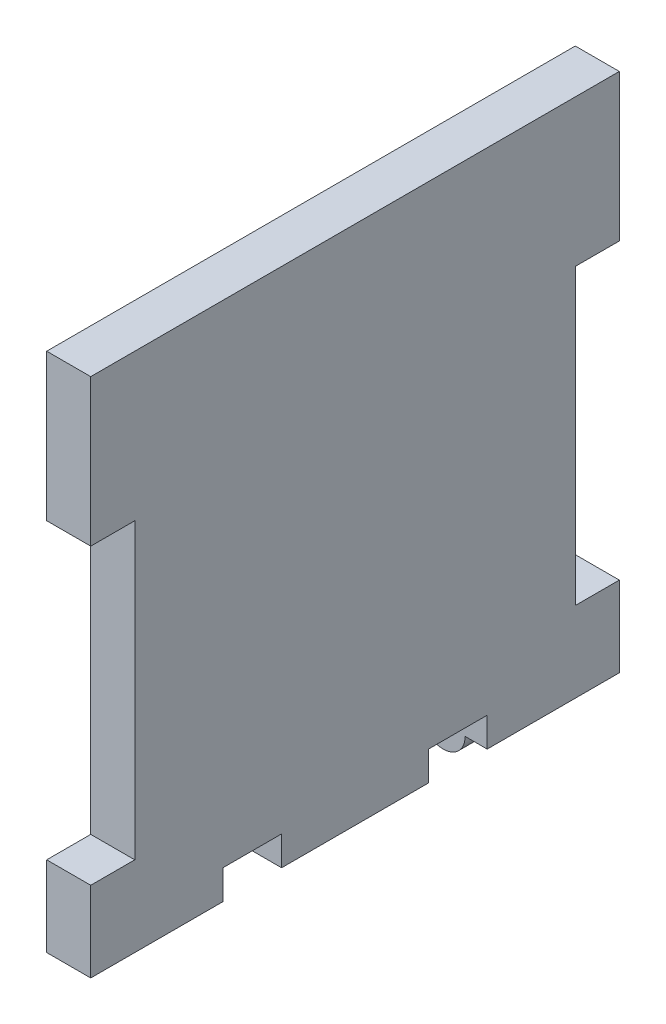
ISO-10303-21;
HEADER;
FILE_DESCRIPTION(('STEP AP214'),'2;1');
FILE_NAME('part.step','',(''),(''),'','','');
FILE_SCHEMA(('AUTOMOTIVE_DESIGN { 1 0 10303 214 1 1 1 1 }'));
ENDSEC;
DATA;
#1=APPLICATION_CONTEXT('core data for automotive mechanical design processes');
#2=APPLICATION_PROTOCOL_DEFINITION('international standard','automotive_design',2000,#1);
#3=PRODUCT_CONTEXT('',#1,'mechanical');
#4=PRODUCT('Part','Part','',(#3));
#5=PRODUCT_RELATED_PRODUCT_CATEGORY('part','',(#4));
#6=PRODUCT_DEFINITION_FORMATION('','',#4);
#7=PRODUCT_DEFINITION_CONTEXT('part definition',#1,'design');
#8=PRODUCT_DEFINITION('design','',#6,#7);
#9=PRODUCT_DEFINITION_SHAPE('','',#8);
#10=(LENGTH_UNIT() NAMED_UNIT(*) SI_UNIT(.MILLI.,.METRE.));
#11=(NAMED_UNIT(*) PLANE_ANGLE_UNIT() SI_UNIT($,.RADIAN.));
#12=(NAMED_UNIT(*) SI_UNIT($,.STERADIAN.) SOLID_ANGLE_UNIT());
#13=UNCERTAINTY_MEASURE_WITH_UNIT(LENGTH_MEASURE(1.E-05),#10,'distance_accuracy_value','');
#14=(GEOMETRIC_REPRESENTATION_CONTEXT(3) GLOBAL_UNCERTAINTY_ASSIGNED_CONTEXT((#13)) GLOBAL_UNIT_ASSIGNED_CONTEXT((#10,
#11,#12)) REPRESENTATION_CONTEXT('',''));
#15=CARTESIAN_POINT('',(0.,0.,0.));
#16=DIRECTION('',(0.,0.,1.));
#17=DIRECTION('',(1.,0.,0.));
#18=AXIS2_PLACEMENT_3D('',#15,#16,#17);
#19=CARTESIAN_POINT('',(3.,0.,15.));
#20=DIRECTION('',(0.,1.,0.));
#21=DIRECTION('',(0.,0.,1.));
#22=AXIS2_PLACEMENT_3D('',#19,#20,#21);
#23=PLANE('',#22);
#24=DIRECTION('',(0.,0.,-1.));
#25=VECTOR('',#24,1.);
#26=CARTESIAN_POINT('',(3.,0.,-15.));
#27=LINE('',#26,#25);
#28=CARTESIAN_POINT('',(3.,0.,5.));
#29=VERTEX_POINT('',#28);
#30=CARTESIAN_POINT('',(3.,0.,-5.));
#31=VERTEX_POINT('',#30);
#32=EDGE_CURVE('E323',#29,#31,#27,.T.);
#33=ORIENTED_EDGE('',*,*,#32,.F.);
#34=DIRECTION('',(-1.,0.,0.));
#35=VECTOR('',#34,1.);
#36=CARTESIAN_POINT('',(10.,0.,5.));
#37=LINE('',#36,#35);
#38=CARTESIAN_POINT('',(0.,0.,5.));
#39=VERTEX_POINT('',#38);
#40=EDGE_CURVE('E272',#29,#39,#37,.T.);
#41=ORIENTED_EDGE('',*,*,#40,.T.);
#42=DIRECTION('',(0.,0.,-1.));
#43=VECTOR('',#42,1.);
#44=CARTESIAN_POINT('',(0.,0.,15.));
#45=LINE('',#44,#43);
#46=CARTESIAN_POINT('',(0.,0.,-5.));
#47=VERTEX_POINT('',#46);
#48=EDGE_CURVE('E197',#39,#47,#45,.T.);
#49=ORIENTED_EDGE('',*,*,#48,.T.);
#50=DIRECTION('',(-1.,0.,0.));
#51=VECTOR('',#50,1.);
#52=CARTESIAN_POINT('',(10.,0.,-5.));
#53=LINE('',#52,#51);
#54=EDGE_CURVE('E294',#31,#47,#53,.T.);
#55=ORIENTED_EDGE('',*,*,#54,.F.);
#56=EDGE_LOOP('',(#33,#41,#49,#55));
#57=FACE_BOUND('',#56,.T.);
#58=ADVANCED_FACE('F33',(#57),#23,.F.);
#59=CARTESIAN_POINT('',(3.,0.,-9.));
#60=VERTEX_POINT('',#59);
#61=CARTESIAN_POINT('',(3.,0.,-18.));
#62=VERTEX_POINT('',#61);
#63=EDGE_CURVE('E112',#60,#62,#27,.T.);
#64=ORIENTED_EDGE('',*,*,#63,.F.);
#65=DIRECTION('',(-1.,0.,0.));
#66=VECTOR('',#65,1.);
#67=CARTESIAN_POINT('',(10.,0.,-9.));
#68=LINE('',#67,#66);
#69=CARTESIAN_POINT('',(1.49999999999999,0.,-9.));
#70=VERTEX_POINT('',#69);
#71=EDGE_CURVE('E286',#60,#70,#68,.T.);
#72=ORIENTED_EDGE('',*,*,#71,.T.);
#73=DIRECTION('',(0.,0.,1.));
#74=VECTOR('',#73,1.);
#75=CARTESIAN_POINT('',(1.49999999999999,0.,-12.));
#76=LINE('',#75,#74);
#77=CARTESIAN_POINT('',(1.49999999999999,0.,-12.));
#78=VERTEX_POINT('',#77);
#79=EDGE_CURVE('E310',#70,#78,#76,.F.);
#80=ORIENTED_EDGE('',*,*,#79,.T.);
#81=DIRECTION('',(1.,0.,0.));
#82=VECTOR('',#81,1.);
#83=CARTESIAN_POINT('',(3.,0.,-12.));
#84=LINE('',#83,#82);
#85=CARTESIAN_POINT('',(0.,0.,-12.));
#86=VERTEX_POINT('',#85);
#87=EDGE_CURVE('E305',#86,#78,#84,.T.);
#88=ORIENTED_EDGE('',*,*,#87,.F.);
#89=CARTESIAN_POINT('',(0.,0.,-18.));
#90=VERTEX_POINT('',#89);
#91=EDGE_CURVE('E195',#86,#90,#45,.T.);
#92=ORIENTED_EDGE('',*,*,#91,.T.);
#93=DIRECTION('',(-1.,0.,0.));
#94=VECTOR('',#93,1.);
#95=CARTESIAN_POINT('',(3.,0.,-18.));
#96=LINE('',#95,#94);
#97=EDGE_CURVE('E222',#62,#90,#96,.T.);
#98=ORIENTED_EDGE('',*,*,#97,.F.);
#99=EDGE_LOOP('',(#64,#72,#80,#88,#92,#98));
#100=FACE_BOUND('',#99,.T.);
#101=ADVANCED_FACE('F424',(#100),#23,.F.);
#102=DIRECTION('',(0.,0.,1.));
#103=VECTOR('',#102,1.);
#104=CARTESIAN_POINT('',(1.49999999999999,0.,9.));
#105=LINE('',#104,#103);
#106=CARTESIAN_POINT('',(1.49999999999999,0.,12.));
#107=VERTEX_POINT('',#106);
#108=CARTESIAN_POINT('',(1.49999999999999,0.,9.));
#109=VERTEX_POINT('',#108);
#110=EDGE_CURVE('E175',#107,#109,#105,.F.);
#111=ORIENTED_EDGE('',*,*,#110,.T.);
#112=DIRECTION('',(-1.,0.,0.));
#113=VECTOR('',#112,1.);
#114=CARTESIAN_POINT('',(10.,0.,9.));
#115=LINE('',#114,#113);
#116=CARTESIAN_POINT('',(3.,0.,9.));
#117=VERTEX_POINT('',#116);
#118=EDGE_CURVE('E269',#117,#109,#115,.T.);
#119=ORIENTED_EDGE('',*,*,#118,.F.);
#120=CARTESIAN_POINT('',(3.,0.,18.));
#121=VERTEX_POINT('',#120);
#122=EDGE_CURVE('E57',#121,#117,#27,.T.);
#123=ORIENTED_EDGE('',*,*,#122,.F.);
#124=DIRECTION('',(-1.,0.,0.));
#125=VECTOR('',#124,1.);
#126=CARTESIAN_POINT('',(3.,0.,18.));
#127=LINE('',#126,#125);
#128=CARTESIAN_POINT('',(0.,0.,18.));
#129=VERTEX_POINT('',#128);
#130=EDGE_CURVE('E168',#121,#129,#127,.T.);
#131=ORIENTED_EDGE('',*,*,#130,.T.);
#132=CARTESIAN_POINT('',(0.,0.,12.));
#133=VERTEX_POINT('',#132);
#134=EDGE_CURVE('E103',#129,#133,#45,.T.);
#135=ORIENTED_EDGE('',*,*,#134,.T.);
#136=DIRECTION('',(1.,0.,0.));
#137=VECTOR('',#136,1.);
#138=CARTESIAN_POINT('',(3.,0.,12.));
#139=LINE('',#138,#137);
#140=EDGE_CURVE('E48',#133,#107,#139,.T.);
#141=ORIENTED_EDGE('',*,*,#140,.T.);
#142=EDGE_LOOP('',(#111,#119,#123,#131,#135,#141));
#143=FACE_BOUND('',#142,.T.);
#144=ADVANCED_FACE('F351',(#143),#23,.F.);
#145=CARTESIAN_POINT('',(0.,0.,0.));
#146=DIRECTION('',(1.,0.,0.));
#147=DIRECTION('',(0.,0.,-1.));
#148=AXIS2_PLACEMENT_3D('',#145,#146,#147);
#149=PLANE('',#148);
#150=ORIENTED_EDGE('',*,*,#48,.F.);
#151=DIRECTION('',(0.,-1.,0.));
#152=VECTOR('',#151,1.);
#153=CARTESIAN_POINT('',(0.,0.,5.));
#154=LINE('',#153,#152);
#155=CARTESIAN_POINT('',(0.,2.,5.));
#156=VERTEX_POINT('',#155);
#157=EDGE_CURVE('E401',#156,#39,#154,.T.);
#158=ORIENTED_EDGE('',*,*,#157,.F.);
#159=DIRECTION('',(0.,0.,-1.));
#160=VECTOR('',#159,1.);
#161=CARTESIAN_POINT('',(0.,2.,9.));
#162=LINE('',#161,#160);
#163=CARTESIAN_POINT('',(0.,2.,9.));
#164=VERTEX_POINT('',#163);
#165=EDGE_CURVE('E403',#164,#156,#162,.T.);
#166=ORIENTED_EDGE('',*,*,#165,.F.);
#167=DIRECTION('',(0.,1.,0.));
#168=VECTOR('',#167,1.);
#169=CARTESIAN_POINT('',(0.,0.,9.));
#170=LINE('',#169,#168);
#171=CARTESIAN_POINT('',(0.,1.49999999999999,9.));
#172=VERTEX_POINT('',#171);
#173=EDGE_CURVE('E267',#172,#164,#170,.T.);
#174=ORIENTED_EDGE('',*,*,#173,.F.);
#175=DIRECTION('',(0.,0.,1.));
#176=VECTOR('',#175,1.);
#177=CARTESIAN_POINT('',(0.,1.49999999999999,9.));
#178=LINE('',#177,#176);
#179=CARTESIAN_POINT('',(0.,1.49999999999999,12.));
#180=VERTEX_POINT('',#179);
#181=EDGE_CURVE('E227',#172,#180,#178,.T.);
#182=ORIENTED_EDGE('',*,*,#181,.T.);
#183=DIRECTION('',(0.,-1.,0.));
#184=VECTOR('',#183,1.);
#185=CARTESIAN_POINT('',(0.,0.,12.));
#186=LINE('',#185,#184);
#187=EDGE_CURVE('E225',#180,#133,#186,.T.);
#188=ORIENTED_EDGE('',*,*,#187,.T.);
#189=ORIENTED_EDGE('',*,*,#134,.F.);
#190=DIRECTION('',(0.,-1.,0.));
#191=VECTOR('',#190,1.);
#192=CARTESIAN_POINT('',(0.,0.,18.));
#193=LINE('',#192,#191);
#194=CARTESIAN_POINT('',(0.,5.47,18.));
#195=VERTEX_POINT('',#194);
#196=EDGE_CURVE('E193',#195,#129,#193,.T.);
#197=ORIENTED_EDGE('',*,*,#196,.F.);
#198=DIRECTION('',(0.,0.,1.));
#199=VECTOR('',#198,1.);
#200=CARTESIAN_POINT('',(0.,5.47,15.));
#201=LINE('',#200,#199);
#202=CARTESIAN_POINT('',(0.,5.47,15.));
#203=VERTEX_POINT('',#202);
#204=EDGE_CURVE('E191',#203,#195,#201,.T.);
#205=ORIENTED_EDGE('',*,*,#204,.F.);
#206=DIRECTION('',(0.,-1.,0.));
#207=VECTOR('',#206,1.);
#208=CARTESIAN_POINT('',(0.,5.47,15.));
#209=LINE('',#208,#207);
#210=CARTESIAN_POINT('',(0.,25.47,15.));
#211=VERTEX_POINT('',#210);
#212=EDGE_CURVE('E157',#211,#203,#209,.T.);
#213=ORIENTED_EDGE('',*,*,#212,.F.);
#214=DIRECTION('',(0.,0.,-1.));
#215=VECTOR('',#214,1.);
#216=CARTESIAN_POINT('',(0.,25.47,18.));
#217=LINE('',#216,#215);
#218=CARTESIAN_POINT('',(0.,25.47,18.));
#219=VERTEX_POINT('',#218);
#220=EDGE_CURVE('E188',#219,#211,#217,.T.);
#221=ORIENTED_EDGE('',*,*,#220,.F.);
#222=DIRECTION('',(0.,-1.,0.));
#223=VECTOR('',#222,1.);
#224=CARTESIAN_POINT('',(0.,25.47,18.));
#225=LINE('',#224,#223);
#226=CARTESIAN_POINT('',(0.,35.47,18.));
#227=VERTEX_POINT('',#226);
#228=EDGE_CURVE('E186',#227,#219,#225,.T.);
#229=ORIENTED_EDGE('',*,*,#228,.F.);
#230=DIRECTION('',(0.,0.,1.));
#231=VECTOR('',#230,1.);
#232=CARTESIAN_POINT('',(0.,35.47,18.));
#233=LINE('',#232,#231);
#234=CARTESIAN_POINT('',(0.,35.47,-18.));
#235=VERTEX_POINT('',#234);
#236=EDGE_CURVE('E184',#235,#227,#233,.T.);
#237=ORIENTED_EDGE('',*,*,#236,.F.);
#238=DIRECTION('',(0.,1.,0.));
#239=VECTOR('',#238,1.);
#240=CARTESIAN_POINT('',(0.,25.47,-18.));
#241=LINE('',#240,#239);
#242=CARTESIAN_POINT('',(0.,25.47,-18.));
#243=VERTEX_POINT('',#242);
#244=EDGE_CURVE('E181',#243,#235,#241,.T.);
#245=ORIENTED_EDGE('',*,*,#244,.F.);
#246=DIRECTION('',(0.,0.,-1.));
#247=VECTOR('',#246,1.);
#248=CARTESIAN_POINT('',(0.,25.47,-18.));
#249=LINE('',#248,#247);
#250=CARTESIAN_POINT('',(0.,25.47,-15.));
#251=VERTEX_POINT('',#250);
#252=EDGE_CURVE('E179',#251,#243,#249,.T.);
#253=ORIENTED_EDGE('',*,*,#252,.F.);
#254=DIRECTION('',(0.,1.,0.));
#255=VECTOR('',#254,1.);
#256=CARTESIAN_POINT('',(0.,5.47,-15.));
#257=LINE('',#256,#255);
#258=CARTESIAN_POINT('',(0.,5.47,-15.));
#259=VERTEX_POINT('',#258);
#260=EDGE_CURVE('E177',#259,#251,#257,.T.);
#261=ORIENTED_EDGE('',*,*,#260,.F.);
#262=DIRECTION('',(0.,0.,1.));
#263=VECTOR('',#262,1.);
#264=CARTESIAN_POINT('',(0.,5.47,-15.));
#265=LINE('',#264,#263);
#266=CARTESIAN_POINT('',(0.,5.47,-18.));
#267=VERTEX_POINT('',#266);
#268=EDGE_CURVE('E174',#267,#259,#265,.T.);
#269=ORIENTED_EDGE('',*,*,#268,.F.);
#270=DIRECTION('',(0.,1.,0.));
#271=VECTOR('',#270,1.);
#272=CARTESIAN_POINT('',(0.,0.,-18.));
#273=LINE('',#272,#271);
#274=EDGE_CURVE('E172',#90,#267,#273,.T.);
#275=ORIENTED_EDGE('',*,*,#274,.F.);
#276=ORIENTED_EDGE('',*,*,#91,.F.);
#277=DIRECTION('',(0.,-1.,0.));
#278=VECTOR('',#277,1.);
#279=CARTESIAN_POINT('',(0.,0.,-12.));
#280=LINE('',#279,#278);
#281=CARTESIAN_POINT('',(0.,1.49999999999999,-12.));
#282=VERTEX_POINT('',#281);
#283=EDGE_CURVE('E233',#282,#86,#280,.T.);
#284=ORIENTED_EDGE('',*,*,#283,.F.);
#285=DIRECTION('',(0.,0.,1.));
#286=VECTOR('',#285,1.);
#287=CARTESIAN_POINT('',(0.,1.49999999999999,-12.));
#288=LINE('',#287,#286);
#289=CARTESIAN_POINT('',(0.,1.49999999999999,-9.));
#290=VERTEX_POINT('',#289);
#291=EDGE_CURVE('E230',#282,#290,#288,.T.);
#292=ORIENTED_EDGE('',*,*,#291,.T.);
#293=DIRECTION('',(0.,-1.,0.));
#294=VECTOR('',#293,1.);
#295=CARTESIAN_POINT('',(0.,0.,-9.));
#296=LINE('',#295,#294);
#297=CARTESIAN_POINT('',(0.,2.,-9.));
#298=VERTEX_POINT('',#297);
#299=EDGE_CURVE('E271',#298,#290,#296,.T.);
#300=ORIENTED_EDGE('',*,*,#299,.F.);
#301=DIRECTION('',(0.,0.,-1.));
#302=VECTOR('',#301,1.);
#303=CARTESIAN_POINT('',(0.,2.,-9.));
#304=LINE('',#303,#302);
#305=CARTESIAN_POINT('',(0.,2.,-5.));
#306=VERTEX_POINT('',#305);
#307=EDGE_CURVE('E283',#306,#298,#304,.T.);
#308=ORIENTED_EDGE('',*,*,#307,.F.);
#309=DIRECTION('',(0.,1.,0.));
#310=VECTOR('',#309,1.);
#311=CARTESIAN_POINT('',(0.,0.,-5.));
#312=LINE('',#311,#310);
#313=EDGE_CURVE('E275',#47,#306,#312,.T.);
#314=ORIENTED_EDGE('',*,*,#313,.F.);
#315=EDGE_LOOP('',(#150,#158,#166,#174,#182,#188,#189,#197,#205,#213,#221,#229,#237,#245,#253,
#261,#269,#275,#276,#284,#292,#300,#308,#314));
#316=FACE_BOUND('',#315,.T.);
#317=ADVANCED_FACE('F347',(#316),#149,.F.);
#318=CARTESIAN_POINT('',(3.,0.,-18.));
#319=DIRECTION('',(0.,0.,1.));
#320=DIRECTION('',(1.,0.,0.));
#321=AXIS2_PLACEMENT_3D('',#318,#319,#320);
#322=PLANE('',#321);
#323=ORIENTED_EDGE('',*,*,#274,.T.);
#324=DIRECTION('',(-1.,0.,0.));
#325=VECTOR('',#324,1.);
#326=CARTESIAN_POINT('',(3.,5.47,-18.));
#327=LINE('',#326,#325);
#328=CARTESIAN_POINT('',(3.,5.47,-18.));
#329=VERTEX_POINT('',#328);
#330=EDGE_CURVE('E219',#329,#267,#327,.T.);
#331=ORIENTED_EDGE('',*,*,#330,.F.);
#332=DIRECTION('',(0.,1.,0.));
#333=VECTOR('',#332,1.);
#334=CARTESIAN_POINT('',(3.,0.,-18.));
#335=LINE('',#334,#333);
#336=EDGE_CURVE('E322',#62,#329,#335,.T.);
#337=ORIENTED_EDGE('',*,*,#336,.F.);
#338=ORIENTED_EDGE('',*,*,#97,.T.);
#339=EDGE_LOOP('',(#323,#331,#337,#338));
#340=FACE_BOUND('',#339,.T.);
#341=ADVANCED_FACE('F35',(#340),#322,.F.);
#342=CARTESIAN_POINT('',(3.,5.47,-15.));
#343=DIRECTION('',(0.,-1.,0.));
#344=DIRECTION('',(0.,0.,-1.));
#345=AXIS2_PLACEMENT_3D('',#342,#343,#344);
#346=PLANE('',#345);
#347=ORIENTED_EDGE('',*,*,#268,.T.);
#348=DIRECTION('',(-1.,0.,0.));
#349=VECTOR('',#348,1.);
#350=CARTESIAN_POINT('',(3.,5.47,-15.));
#351=LINE('',#350,#349);
#352=CARTESIAN_POINT('',(3.,5.47,-15.));
#353=VERTEX_POINT('',#352);
#354=EDGE_CURVE('E216',#353,#259,#351,.T.);
#355=ORIENTED_EDGE('',*,*,#354,.F.);
#356=DIRECTION('',(0.,0.,1.));
#357=VECTOR('',#356,1.);
#358=CARTESIAN_POINT('',(3.,5.47,-15.));
#359=LINE('',#358,#357);
#360=EDGE_CURVE('E325',#329,#353,#359,.T.);
#361=ORIENTED_EDGE('',*,*,#360,.F.);
#362=ORIENTED_EDGE('',*,*,#330,.T.);
#363=EDGE_LOOP('',(#347,#355,#361,#362));
#364=FACE_BOUND('',#363,.T.);
#365=ADVANCED_FACE('F441',(#364),#346,.F.);
#366=CARTESIAN_POINT('',(3.,5.47,-15.));
#367=DIRECTION('',(0.,0.,1.));
#368=DIRECTION('',(1.,0.,0.));
#369=AXIS2_PLACEMENT_3D('',#366,#367,#368);
#370=PLANE('',#369);
#371=ORIENTED_EDGE('',*,*,#260,.T.);
#372=DIRECTION('',(-1.,0.,0.));
#373=VECTOR('',#372,1.);
#374=CARTESIAN_POINT('',(3.,25.47,-15.));
#375=LINE('',#374,#373);
#376=CARTESIAN_POINT('',(3.,25.47,-15.));
#377=VERTEX_POINT('',#376);
#378=EDGE_CURVE('E213',#377,#251,#375,.T.);
#379=ORIENTED_EDGE('',*,*,#378,.F.);
#380=DIRECTION('',(0.,1.,0.));
#381=VECTOR('',#380,1.);
#382=CARTESIAN_POINT('',(3.,5.47,-15.));
#383=LINE('',#382,#381);
#384=EDGE_CURVE('E327',#353,#377,#383,.T.);
#385=ORIENTED_EDGE('',*,*,#384,.F.);
#386=ORIENTED_EDGE('',*,*,#354,.T.);
#387=EDGE_LOOP('',(#371,#379,#385,#386));
#388=FACE_BOUND('',#387,.T.);
#389=ADVANCED_FACE('F544',(#388),#370,.F.);
#390=CARTESIAN_POINT('',(3.,25.47,-18.));
#391=DIRECTION('',(0.,1.,0.));
#392=DIRECTION('',(0.,0.,1.));
#393=AXIS2_PLACEMENT_3D('',#390,#391,#392);
#394=PLANE('',#393);
#395=ORIENTED_EDGE('',*,*,#252,.T.);
#396=DIRECTION('',(-1.,0.,0.));
#397=VECTOR('',#396,1.);
#398=CARTESIAN_POINT('',(3.,25.47,-18.));
#399=LINE('',#398,#397);
#400=CARTESIAN_POINT('',(3.,25.47,-18.));
#401=VERTEX_POINT('',#400);
#402=EDGE_CURVE('E210',#401,#243,#399,.T.);
#403=ORIENTED_EDGE('',*,*,#402,.F.);
#404=DIRECTION('',(0.,0.,-1.));
#405=VECTOR('',#404,1.);
#406=CARTESIAN_POINT('',(3.,25.47,-18.));
#407=LINE('',#406,#405);
#408=EDGE_CURVE('E329',#377,#401,#407,.T.);
#409=ORIENTED_EDGE('',*,*,#408,.F.);
#410=ORIENTED_EDGE('',*,*,#378,.T.);
#411=EDGE_LOOP('',(#395,#403,#409,#410));
#412=FACE_BOUND('',#411,.T.);
#413=ADVANCED_FACE('F549',(#412),#394,.F.);
#414=CARTESIAN_POINT('',(3.,25.47,-18.));
#415=DIRECTION('',(0.,0.,1.));
#416=DIRECTION('',(1.,0.,0.));
#417=AXIS2_PLACEMENT_3D('',#414,#415,#416);
#418=PLANE('',#417);
#419=ORIENTED_EDGE('',*,*,#244,.T.);
#420=DIRECTION('',(-1.,0.,0.));
#421=VECTOR('',#420,1.);
#422=CARTESIAN_POINT('',(3.,35.47,-18.));
#423=LINE('',#422,#421);
#424=CARTESIAN_POINT('',(3.,35.47,-18.));
#425=VERTEX_POINT('',#424);
#426=EDGE_CURVE('E207',#425,#235,#423,.T.);
#427=ORIENTED_EDGE('',*,*,#426,.F.);
#428=DIRECTION('',(0.,1.,0.));
#429=VECTOR('',#428,1.);
#430=CARTESIAN_POINT('',(3.,25.47,-18.));
#431=LINE('',#430,#429);
#432=EDGE_CURVE('E331',#401,#425,#431,.T.);
#433=ORIENTED_EDGE('',*,*,#432,.F.);
#434=ORIENTED_EDGE('',*,*,#402,.T.);
#435=EDGE_LOOP('',(#419,#427,#433,#434));
#436=FACE_BOUND('',#435,.T.);
#437=ADVANCED_FACE('F553',(#436),#418,.F.);
#438=CARTESIAN_POINT('',(3.,35.47,18.));
#439=DIRECTION('',(0.,-1.,0.));
#440=DIRECTION('',(0.,0.,-1.));
#441=AXIS2_PLACEMENT_3D('',#438,#439,#440);
#442=PLANE('',#441);
#443=ORIENTED_EDGE('',*,*,#236,.T.);
#444=DIRECTION('',(-1.,0.,0.));
#445=VECTOR('',#444,1.);
#446=CARTESIAN_POINT('',(3.,35.47,18.));
#447=LINE('',#446,#445);
#448=CARTESIAN_POINT('',(3.,35.47,18.));
#449=VERTEX_POINT('',#448);
#450=EDGE_CURVE('E204',#449,#227,#447,.T.);
#451=ORIENTED_EDGE('',*,*,#450,.F.);
#452=DIRECTION('',(0.,0.,1.));
#453=VECTOR('',#452,1.);
#454=CARTESIAN_POINT('',(3.,35.47,-18.));
#455=LINE('',#454,#453);
#456=EDGE_CURVE('E333',#425,#449,#455,.T.);
#457=ORIENTED_EDGE('',*,*,#456,.F.);
#458=ORIENTED_EDGE('',*,*,#426,.T.);
#459=EDGE_LOOP('',(#443,#451,#457,#458));
#460=FACE_BOUND('',#459,.T.);
#461=ADVANCED_FACE('F556',(#460),#442,.F.);
#462=CARTESIAN_POINT('',(3.,25.47,18.));
#463=DIRECTION('',(0.,0.,-1.));
#464=DIRECTION('',(-1.,0.,0.));
#465=AXIS2_PLACEMENT_3D('',#462,#463,#464);
#466=PLANE('',#465);
#467=ORIENTED_EDGE('',*,*,#228,.T.);
#468=DIRECTION('',(-1.,0.,0.));
#469=VECTOR('',#468,1.);
#470=CARTESIAN_POINT('',(3.,25.47,18.));
#471=LINE('',#470,#469);
#472=CARTESIAN_POINT('',(3.,25.47,18.));
#473=VERTEX_POINT('',#472);
#474=EDGE_CURVE('E201',#473,#219,#471,.T.);
#475=ORIENTED_EDGE('',*,*,#474,.F.);
#476=DIRECTION('',(0.,-1.,0.));
#477=VECTOR('',#476,1.);
#478=CARTESIAN_POINT('',(3.,25.47,18.));
#479=LINE('',#478,#477);
#480=EDGE_CURVE('E335',#449,#473,#479,.T.);
#481=ORIENTED_EDGE('',*,*,#480,.F.);
#482=ORIENTED_EDGE('',*,*,#450,.T.);
#483=EDGE_LOOP('',(#467,#475,#481,#482));
#484=FACE_BOUND('',#483,.T.);
#485=ADVANCED_FACE('F341',(#484),#466,.F.);
#486=CARTESIAN_POINT('',(3.,25.47,18.));
#487=DIRECTION('',(0.,1.,0.));
#488=DIRECTION('',(0.,0.,1.));
#489=AXIS2_PLACEMENT_3D('',#486,#487,#488);
#490=PLANE('',#489);
#491=ORIENTED_EDGE('',*,*,#220,.T.);
#492=DIRECTION('',(-1.,0.,0.));
#493=VECTOR('',#492,1.);
#494=CARTESIAN_POINT('',(3.,25.47,15.));
#495=LINE('',#494,#493);
#496=CARTESIAN_POINT('',(3.,25.47,15.));
#497=VERTEX_POINT('',#496);
#498=EDGE_CURVE('E160',#497,#211,#495,.T.);
#499=ORIENTED_EDGE('',*,*,#498,.F.);
#500=DIRECTION('',(0.,0.,-1.));
#501=VECTOR('',#500,1.);
#502=CARTESIAN_POINT('',(3.,25.47,18.));
#503=LINE('',#502,#501);
#504=EDGE_CURVE('E148',#473,#497,#503,.T.);
#505=ORIENTED_EDGE('',*,*,#504,.F.);
#506=ORIENTED_EDGE('',*,*,#474,.T.);
#507=EDGE_LOOP('',(#491,#499,#505,#506));
#508=FACE_BOUND('',#507,.T.);
#509=ADVANCED_FACE('F345',(#508),#490,.F.);
#510=CARTESIAN_POINT('',(3.,5.47,15.));
#511=DIRECTION('',(0.,0.,-1.));
#512=DIRECTION('',(0.,1.,0.));
#513=AXIS2_PLACEMENT_3D('',#510,#511,#512);
#514=PLANE('',#513);
#515=ORIENTED_EDGE('',*,*,#212,.T.);
#516=DIRECTION('',(-1.,0.,0.));
#517=VECTOR('',#516,1.);
#518=CARTESIAN_POINT('',(3.,5.47,15.));
#519=LINE('',#518,#517);
#520=CARTESIAN_POINT('',(3.,5.47,15.));
#521=VERTEX_POINT('',#520);
#522=EDGE_CURVE('E154',#521,#203,#519,.T.);
#523=ORIENTED_EDGE('',*,*,#522,.F.);
#524=DIRECTION('',(0.,-1.,0.));
#525=VECTOR('',#524,1.);
#526=CARTESIAN_POINT('',(3.,5.47,15.));
#527=LINE('',#526,#525);
#528=EDGE_CURVE('E140',#497,#521,#527,.T.);
#529=ORIENTED_EDGE('',*,*,#528,.F.);
#530=ORIENTED_EDGE('',*,*,#498,.T.);
#531=EDGE_LOOP('',(#515,#523,#529,#530));
#532=FACE_BOUND('',#531,.T.);
#533=ADVANCED_FACE('F155',(#532),#514,.F.);
#534=CARTESIAN_POINT('',(3.,5.47,15.));
#535=DIRECTION('',(0.,-1.,0.));
#536=DIRECTION('',(0.,0.,-1.));
#537=AXIS2_PLACEMENT_3D('',#534,#535,#536);
#538=PLANE('',#537);
#539=ORIENTED_EDGE('',*,*,#204,.T.);
#540=DIRECTION('',(-1.,0.,0.));
#541=VECTOR('',#540,1.);
#542=CARTESIAN_POINT('',(3.,5.47,18.));
#543=LINE('',#542,#541);
#544=CARTESIAN_POINT('',(3.,5.47,18.));
#545=VERTEX_POINT('',#544);
#546=EDGE_CURVE('E161',#545,#195,#543,.T.);
#547=ORIENTED_EDGE('',*,*,#546,.F.);
#548=DIRECTION('',(0.,0.,1.));
#549=VECTOR('',#548,1.);
#550=CARTESIAN_POINT('',(3.,5.47,15.));
#551=LINE('',#550,#549);
#552=EDGE_CURVE('E145',#521,#545,#551,.T.);
#553=ORIENTED_EDGE('',*,*,#552,.F.);
#554=ORIENTED_EDGE('',*,*,#522,.T.);
#555=EDGE_LOOP('',(#539,#547,#553,#554));
#556=FACE_BOUND('',#555,.T.);
#557=ADVANCED_FACE('F163',(#556),#538,.F.);
#558=CARTESIAN_POINT('',(3.,0.,18.));
#559=DIRECTION('',(0.,0.,-1.));
#560=DIRECTION('',(0.,1.,0.));
#561=AXIS2_PLACEMENT_3D('',#558,#559,#560);
#562=PLANE('',#561);
#563=ORIENTED_EDGE('',*,*,#196,.T.);
#564=ORIENTED_EDGE('',*,*,#130,.F.);
#565=DIRECTION('',(0.,-1.,0.));
#566=VECTOR('',#565,1.);
#567=CARTESIAN_POINT('',(3.,0.,18.));
#568=LINE('',#567,#566);
#569=EDGE_CURVE('E166',#545,#121,#568,.T.);
#570=ORIENTED_EDGE('',*,*,#569,.F.);
#571=ORIENTED_EDGE('',*,*,#546,.T.);
#572=EDGE_LOOP('',(#563,#564,#570,#571));
#573=FACE_BOUND('',#572,.T.);
#574=ADVANCED_FACE('F349',(#573),#562,.F.);
#575=CARTESIAN_POINT('',(3.,0.,0.));
#576=DIRECTION('',(1.,0.,0.));
#577=DIRECTION('',(0.,0.,-1.));
#578=AXIS2_PLACEMENT_3D('',#575,#576,#577);
#579=PLANE('',#578);
#580=DIRECTION('',(0.,1.,0.));
#581=VECTOR('',#580,1.);
#582=CARTESIAN_POINT('',(3.,0.,5.));
#583=LINE('',#582,#581);
#584=CARTESIAN_POINT('',(3.,2.,5.));
#585=VERTEX_POINT('',#584);
#586=EDGE_CURVE('E11',#29,#585,#583,.T.);
#587=ORIENTED_EDGE('',*,*,#586,.F.);
#588=ORIENTED_EDGE('',*,*,#32,.T.);
#589=DIRECTION('',(0.,-1.,0.));
#590=VECTOR('',#589,1.);
#591=CARTESIAN_POINT('',(3.,0.,-5.));
#592=LINE('',#591,#590);
#593=CARTESIAN_POINT('',(3.,2.,-5.));
#594=VERTEX_POINT('',#593);
#595=EDGE_CURVE('E236',#594,#31,#592,.T.);
#596=ORIENTED_EDGE('',*,*,#595,.F.);
#597=DIRECTION('',(0.,0.,1.));
#598=VECTOR('',#597,1.);
#599=CARTESIAN_POINT('',(3.,2.,0.));
#600=LINE('',#599,#598);
#601=CARTESIAN_POINT('',(3.,2.,-9.));
#602=VERTEX_POINT('',#601);
#603=EDGE_CURVE('E239',#602,#594,#600,.T.);
#604=ORIENTED_EDGE('',*,*,#603,.F.);
#605=DIRECTION('',(0.,1.,0.));
#606=VECTOR('',#605,1.);
#607=CARTESIAN_POINT('',(3.,0.,-9.));
#608=LINE('',#607,#606);
#609=EDGE_CURVE('E290',#60,#602,#608,.T.);
#610=ORIENTED_EDGE('',*,*,#609,.F.);
#611=ORIENTED_EDGE('',*,*,#63,.T.);
#612=ORIENTED_EDGE('',*,*,#336,.T.);
#613=ORIENTED_EDGE('',*,*,#360,.T.);
#614=ORIENTED_EDGE('',*,*,#384,.T.);
#615=ORIENTED_EDGE('',*,*,#408,.T.);
#616=ORIENTED_EDGE('',*,*,#432,.T.);
#617=ORIENTED_EDGE('',*,*,#456,.T.);
#618=ORIENTED_EDGE('',*,*,#480,.T.);
#619=ORIENTED_EDGE('',*,*,#504,.T.);
#620=ORIENTED_EDGE('',*,*,#528,.T.);
#621=ORIENTED_EDGE('',*,*,#552,.T.);
#622=ORIENTED_EDGE('',*,*,#569,.T.);
#623=ORIENTED_EDGE('',*,*,#122,.T.);
#624=DIRECTION('',(0.,-1.,0.));
#625=VECTOR('',#624,1.);
#626=CARTESIAN_POINT('',(3.,0.,9.));
#627=LINE('',#626,#625);
#628=CARTESIAN_POINT('',(3.,2.,9.));
#629=VERTEX_POINT('',#628);
#630=EDGE_CURVE('E264',#629,#117,#627,.T.);
#631=ORIENTED_EDGE('',*,*,#630,.F.);
#632=DIRECTION('',(0.,0.,1.));
#633=VECTOR('',#632,1.);
#634=CARTESIAN_POINT('',(3.,2.,0.));
#635=LINE('',#634,#633);
#636=EDGE_CURVE('E41',#585,#629,#635,.T.);
#637=ORIENTED_EDGE('',*,*,#636,.F.);
#638=EDGE_LOOP('',(#587,#588,#596,#604,#610,#611,#612,#613,#614,#615,#616,#617,#618,#619,#620,
#621,#622,#623,#631,#637));
#639=FACE_BOUND('',#638,.T.);
#640=ADVANCED_FACE('F143',(#639),#579,.T.);
#641=CARTESIAN_POINT('',(0.,0.,9.));
#642=DIRECTION('',(0.,0.,1.));
#643=DIRECTION('',(1.,0.,0.));
#644=AXIS2_PLACEMENT_3D('',#641,#642,#643);
#645=CYLINDRICAL_SURFACE('',#644,1.49999999999999);
#646=ORIENTED_EDGE('',*,*,#110,.F.);
#647=CARTESIAN_POINT('',(0.,0.,12.));
#648=DIRECTION('',(0.,0.,1.));
#649=DIRECTION('',(1.,0.,0.));
#650=AXIS2_PLACEMENT_3D('',#647,#648,#649);
#651=CIRCLE('',#650,1.49999999999999);
#652=EDGE_CURVE('E313',#180,#107,#651,.T.);
#653=ORIENTED_EDGE('',*,*,#652,.F.);
#654=ORIENTED_EDGE('',*,*,#181,.F.);
#655=CARTESIAN_POINT('',(0.,0.,9.));
#656=DIRECTION('',(0.,0.,1.));
#657=DIRECTION('',(1.,0.,0.));
#658=AXIS2_PLACEMENT_3D('',#655,#656,#657);
#659=CIRCLE('',#658,1.49999999999999);
#660=EDGE_CURVE('E314',#172,#109,#659,.T.);
#661=ORIENTED_EDGE('',*,*,#660,.T.);
#662=EDGE_LOOP('',(#646,#653,#654,#661));
#663=FACE_BOUND('',#662,.T.);
#664=ADVANCED_FACE('F409',(#663),#645,.T.);
#665=CARTESIAN_POINT('',(0.,0.,9.));
#666=DIRECTION('',(0.,0.,1.));
#667=DIRECTION('',(1.,0.,0.));
#668=AXIS2_PLACEMENT_3D('',#665,#666,#667);
#669=PLANE('',#668);
#670=ORIENTED_EDGE('',*,*,#118,.T.);
#671=ORIENTED_EDGE('',*,*,#660,.F.);
#672=ORIENTED_EDGE('',*,*,#173,.T.);
#673=DIRECTION('',(-1.,0.,0.));
#674=VECTOR('',#673,1.);
#675=CARTESIAN_POINT('',(10.,2.,9.));
#676=LINE('',#675,#674);
#677=EDGE_CURVE('E251',#629,#164,#676,.T.);
#678=ORIENTED_EDGE('',*,*,#677,.F.);
#679=ORIENTED_EDGE('',*,*,#630,.T.);
#680=EDGE_LOOP('',(#670,#671,#672,#678,#679));
#681=FACE_BOUND('',#680,.T.);
#682=ADVANCED_FACE('F262',(#681),#669,.F.);
#683=CARTESIAN_POINT('',(0.,0.,12.));
#684=DIRECTION('',(0.,0.,1.));
#685=DIRECTION('',(1.,0.,0.));
#686=AXIS2_PLACEMENT_3D('',#683,#684,#685);
#687=PLANE('',#686);
#688=ORIENTED_EDGE('',*,*,#140,.F.);
#689=ORIENTED_EDGE('',*,*,#187,.F.);
#690=ORIENTED_EDGE('',*,*,#652,.T.);
#691=EDGE_LOOP('',(#688,#689,#690));
#692=FACE_BOUND('',#691,.T.);
#693=ADVANCED_FACE('F410',(#692),#687,.T.);
#694=CARTESIAN_POINT('',(0.,0.,-12.));
#695=DIRECTION('',(0.,0.,1.));
#696=DIRECTION('',(1.,0.,0.));
#697=AXIS2_PLACEMENT_3D('',#694,#695,#696);
#698=CYLINDRICAL_SURFACE('',#697,1.49999999999999);
#699=ORIENTED_EDGE('',*,*,#79,.F.);
#700=CARTESIAN_POINT('',(0.,0.,-9.));
#701=DIRECTION('',(0.,0.,1.));
#702=DIRECTION('',(1.,0.,0.));
#703=AXIS2_PLACEMENT_3D('',#700,#701,#702);
#704=CIRCLE('',#703,1.49999999999999);
#705=EDGE_CURVE('E301',#290,#70,#704,.T.);
#706=ORIENTED_EDGE('',*,*,#705,.F.);
#707=ORIENTED_EDGE('',*,*,#291,.F.);
#708=CARTESIAN_POINT('',(0.,0.,-12.));
#709=DIRECTION('',(0.,0.,1.));
#710=DIRECTION('',(1.,0.,0.));
#711=AXIS2_PLACEMENT_3D('',#708,#709,#710);
#712=CIRCLE('',#711,1.49999999999999);
#713=EDGE_CURVE('E302',#282,#78,#712,.T.);
#714=ORIENTED_EDGE('',*,*,#713,.T.);
#715=EDGE_LOOP('',(#699,#706,#707,#714));
#716=FACE_BOUND('',#715,.T.);
#717=ADVANCED_FACE('F412',(#716),#698,.T.);
#718=CARTESIAN_POINT('',(0.,0.,-12.));
#719=DIRECTION('',(0.,0.,1.));
#720=DIRECTION('',(1.,0.,0.));
#721=AXIS2_PLACEMENT_3D('',#718,#719,#720);
#722=PLANE('',#721);
#723=ORIENTED_EDGE('',*,*,#283,.T.);
#724=ORIENTED_EDGE('',*,*,#87,.T.);
#725=ORIENTED_EDGE('',*,*,#713,.F.);
#726=EDGE_LOOP('',(#723,#724,#725));
#727=FACE_BOUND('',#726,.T.);
#728=ADVANCED_FACE('F418',(#727),#722,.F.);
#729=CARTESIAN_POINT('',(0.,0.,-9.));
#730=DIRECTION('',(0.,0.,1.));
#731=DIRECTION('',(1.,0.,0.));
#732=AXIS2_PLACEMENT_3D('',#729,#730,#731);
#733=PLANE('',#732);
#734=ORIENTED_EDGE('',*,*,#705,.T.);
#735=ORIENTED_EDGE('',*,*,#71,.F.);
#736=ORIENTED_EDGE('',*,*,#609,.T.);
#737=DIRECTION('',(-1.,0.,0.));
#738=VECTOR('',#737,1.);
#739=CARTESIAN_POINT('',(10.,2.,-9.));
#740=LINE('',#739,#738);
#741=EDGE_CURVE('E287',#602,#298,#740,.T.);
#742=ORIENTED_EDGE('',*,*,#741,.T.);
#743=ORIENTED_EDGE('',*,*,#299,.T.);
#744=EDGE_LOOP('',(#734,#735,#736,#742,#743));
#745=FACE_BOUND('',#744,.T.);
#746=ADVANCED_FACE('F472',(#745),#733,.T.);
#747=CARTESIAN_POINT('',(10.,2.,-9.));
#748=DIRECTION('',(0.,1.,0.));
#749=DIRECTION('',(0.,0.,1.));
#750=AXIS2_PLACEMENT_3D('',#747,#748,#749);
#751=PLANE('',#750);
#752=ORIENTED_EDGE('',*,*,#603,.T.);
#753=DIRECTION('',(-1.,0.,0.));
#754=VECTOR('',#753,1.);
#755=CARTESIAN_POINT('',(10.,2.,-5.));
#756=LINE('',#755,#754);
#757=EDGE_CURVE('E291',#594,#306,#756,.T.);
#758=ORIENTED_EDGE('',*,*,#757,.T.);
#759=ORIENTED_EDGE('',*,*,#307,.T.);
#760=ORIENTED_EDGE('',*,*,#741,.F.);
#761=EDGE_LOOP('',(#752,#758,#759,#760));
#762=FACE_BOUND('',#761,.T.);
#763=ADVANCED_FACE('F476',(#762),#751,.F.);
#764=CARTESIAN_POINT('',(10.,0.,-5.));
#765=DIRECTION('',(0.,0.,1.));
#766=DIRECTION('',(1.,0.,0.));
#767=AXIS2_PLACEMENT_3D('',#764,#765,#766);
#768=PLANE('',#767);
#769=ORIENTED_EDGE('',*,*,#595,.T.);
#770=ORIENTED_EDGE('',*,*,#54,.T.);
#771=ORIENTED_EDGE('',*,*,#313,.T.);
#772=ORIENTED_EDGE('',*,*,#757,.F.);
#773=EDGE_LOOP('',(#769,#770,#771,#772));
#774=FACE_BOUND('',#773,.T.);
#775=ADVANCED_FACE('F487',(#774),#768,.F.);
#776=CARTESIAN_POINT('',(10.,0.,5.));
#777=DIRECTION('',(0.,0.,-1.));
#778=DIRECTION('',(-1.,0.,0.));
#779=AXIS2_PLACEMENT_3D('',#776,#777,#778);
#780=PLANE('',#779);
#781=ORIENTED_EDGE('',*,*,#586,.T.);
#782=DIRECTION('',(-1.,0.,0.));
#783=VECTOR('',#782,1.);
#784=CARTESIAN_POINT('',(10.,2.,5.));
#785=LINE('',#784,#783);
#786=EDGE_CURVE('E255',#585,#156,#785,.T.);
#787=ORIENTED_EDGE('',*,*,#786,.T.);
#788=ORIENTED_EDGE('',*,*,#157,.T.);
#789=ORIENTED_EDGE('',*,*,#40,.F.);
#790=EDGE_LOOP('',(#781,#787,#788,#789));
#791=FACE_BOUND('',#790,.T.);
#792=ADVANCED_FACE('F399',(#791),#780,.F.);
#793=CARTESIAN_POINT('',(10.,2.,9.));
#794=DIRECTION('',(0.,1.,0.));
#795=DIRECTION('',(0.,0.,1.));
#796=AXIS2_PLACEMENT_3D('',#793,#794,#795);
#797=PLANE('',#796);
#798=ORIENTED_EDGE('',*,*,#636,.T.);
#799=ORIENTED_EDGE('',*,*,#677,.T.);
#800=ORIENTED_EDGE('',*,*,#165,.T.);
#801=ORIENTED_EDGE('',*,*,#786,.F.);
#802=EDGE_LOOP('',(#798,#799,#800,#801));
#803=FACE_BOUND('',#802,.T.);
#804=ADVANCED_FACE('F248',(#803),#797,.F.);
#805=CLOSED_SHELL('',(#58,#101,#144,#317,#341,#365,#389,#413,#437,#461,#485,#509,#533,#557,#574,
#640,#664,#682,#693,#717,#728,#746,#763,#775,#792,#804));
#806=MANIFOLD_SOLID_BREP('B2',#805);
#807=ADVANCED_BREP_SHAPE_REPRESENTATION('',(#18,#806),#14);
#808=SHAPE_DEFINITION_REPRESENTATION(#9,#807);
ENDSEC;
END-ISO-10303-21;
